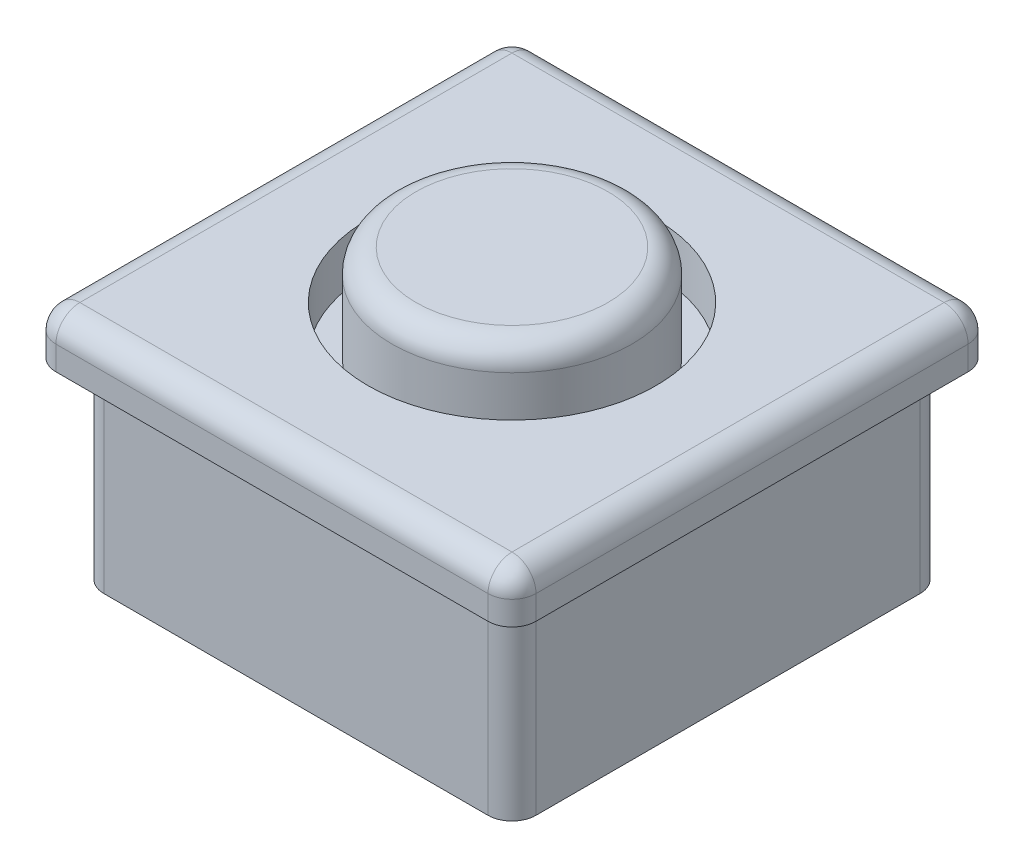
ISO-10303-21;
HEADER;
FILE_DESCRIPTION(('STEP AP214'),'2;1');
FILE_NAME('part.step','',(''),(''),'','','');
FILE_SCHEMA(('AUTOMOTIVE_DESIGN { 1 0 10303 214 1 1 1 1 }'));
ENDSEC;
DATA;
#1=APPLICATION_CONTEXT('core data for automotive mechanical design processes');
#2=APPLICATION_PROTOCOL_DEFINITION('international standard','automotive_design',2000,#1);
#3=PRODUCT_CONTEXT('',#1,'mechanical');
#4=PRODUCT('Part','Part','',(#3));
#5=PRODUCT_RELATED_PRODUCT_CATEGORY('part','',(#4));
#6=PRODUCT_DEFINITION_FORMATION('','',#4);
#7=PRODUCT_DEFINITION_CONTEXT('part definition',#1,'design');
#8=PRODUCT_DEFINITION('design','',#6,#7);
#9=PRODUCT_DEFINITION_SHAPE('','',#8);
#10=(LENGTH_UNIT() NAMED_UNIT(*) SI_UNIT(.MILLI.,.METRE.));
#11=(NAMED_UNIT(*) PLANE_ANGLE_UNIT() SI_UNIT($,.RADIAN.));
#12=(NAMED_UNIT(*) SI_UNIT($,.STERADIAN.) SOLID_ANGLE_UNIT());
#13=UNCERTAINTY_MEASURE_WITH_UNIT(LENGTH_MEASURE(1.E-05),#10,'distance_accuracy_value','');
#14=(GEOMETRIC_REPRESENTATION_CONTEXT(3) GLOBAL_UNCERTAINTY_ASSIGNED_CONTEXT((#13)) GLOBAL_UNIT_ASSIGNED_CONTEXT((#10,
#11,#12)) REPRESENTATION_CONTEXT('',''));
#15=CARTESIAN_POINT('',(0.,0.,0.));
#16=DIRECTION('',(0.,0.,1.));
#17=DIRECTION('',(1.,0.,0.));
#18=AXIS2_PLACEMENT_3D('',#15,#16,#17);
#19=CARTESIAN_POINT('',(1.,0.,-1.));
#20=DIRECTION('',(0.,-1.,0.));
#21=DIRECTION('',(0.,0.,-1.));
#22=AXIS2_PLACEMENT_3D('',#19,#20,#21);
#23=PLANE('',#22);
#24=CARTESIAN_POINT('',(1.,0.,-1.));
#25=DIRECTION('',(0.,1.,0.));
#26=DIRECTION('',(0.,0.,-1.));
#27=AXIS2_PLACEMENT_3D('',#24,#25,#26);
#28=CIRCLE('',#27,1.);
#29=CARTESIAN_POINT('',(0.,0.,-1.00000000000001));
#30=VERTEX_POINT('',#29);
#31=CARTESIAN_POINT('',(1.00000000000001,0.,0.));
#32=VERTEX_POINT('',#31);
#33=EDGE_CURVE('E248',#30,#32,#28,.T.);
#34=ORIENTED_EDGE('',*,*,#33,.F.);
#35=DIRECTION('',(0.,0.,1.));
#36=VECTOR('',#35,1.);
#37=CARTESIAN_POINT('',(0.,0.,-1.00000000000001));
#38=LINE('',#37,#36);
#39=CARTESIAN_POINT('',(0.,0.,-19.));
#40=VERTEX_POINT('',#39);
#41=EDGE_CURVE('E271',#40,#30,#38,.T.);
#42=ORIENTED_EDGE('',*,*,#41,.F.);
#43=CARTESIAN_POINT('',(1.,0.,-19.));
#44=DIRECTION('',(0.,1.,0.));
#45=DIRECTION('',(0.,0.,-1.));
#46=AXIS2_PLACEMENT_3D('',#43,#44,#45);
#47=CIRCLE('',#46,1.);
#48=CARTESIAN_POINT('',(1.00000000000001,0.,-20.));
#49=VERTEX_POINT('',#48);
#50=EDGE_CURVE('E268',#49,#40,#47,.T.);
#51=ORIENTED_EDGE('',*,*,#50,.F.);
#52=DIRECTION('',(-1.,0.,0.));
#53=VECTOR('',#52,1.);
#54=CARTESIAN_POINT('',(1.00000000000001,0.,-20.));
#55=LINE('',#54,#53);
#56=CARTESIAN_POINT('',(19.,0.,-20.));
#57=VERTEX_POINT('',#56);
#58=EDGE_CURVE('E265',#57,#49,#55,.T.);
#59=ORIENTED_EDGE('',*,*,#58,.F.);
#60=CARTESIAN_POINT('',(19.,0.,-19.));
#61=DIRECTION('',(0.,1.,0.));
#62=DIRECTION('',(0.,0.,-1.));
#63=AXIS2_PLACEMENT_3D('',#60,#61,#62);
#64=CIRCLE('',#63,1.);
#65=CARTESIAN_POINT('',(20.,0.,-19.));
#66=VERTEX_POINT('',#65);
#67=EDGE_CURVE('E262',#66,#57,#64,.T.);
#68=ORIENTED_EDGE('',*,*,#67,.F.);
#69=DIRECTION('',(0.,0.,-1.));
#70=VECTOR('',#69,1.);
#71=CARTESIAN_POINT('',(20.,0.,-1.00000000000001));
#72=LINE('',#71,#70);
#73=CARTESIAN_POINT('',(20.,0.,-1.00000000000001));
#74=VERTEX_POINT('',#73);
#75=EDGE_CURVE('E259',#74,#66,#72,.T.);
#76=ORIENTED_EDGE('',*,*,#75,.F.);
#77=CARTESIAN_POINT('',(19.,0.,-1.));
#78=DIRECTION('',(0.,1.,0.));
#79=DIRECTION('',(0.,0.,1.));
#80=AXIS2_PLACEMENT_3D('',#77,#78,#79);
#81=CIRCLE('',#80,1.);
#82=CARTESIAN_POINT('',(19.,0.,0.));
#83=VERTEX_POINT('',#82);
#84=EDGE_CURVE('E256',#83,#74,#81,.T.);
#85=ORIENTED_EDGE('',*,*,#84,.F.);
#86=DIRECTION('',(1.,0.,0.));
#87=VECTOR('',#86,1.);
#88=CARTESIAN_POINT('',(1.00000000000001,0.,0.));
#89=LINE('',#88,#87);
#90=EDGE_CURVE('E253',#32,#83,#89,.T.);
#91=ORIENTED_EDGE('',*,*,#90,.F.);
#92=EDGE_LOOP('',(#34,#42,#51,#59,#68,#76,#85,#91));
#93=FACE_BOUND('',#92,.T.);
#94=DIRECTION('',(1.,0.,0.));
#95=VECTOR('',#94,1.);
#96=CARTESIAN_POINT('',(2.00000000000001,0.,-1.));
#97=LINE('',#96,#95);
#98=CARTESIAN_POINT('',(2.00000000000001,0.,-1.));
#99=VERTEX_POINT('',#98);
#100=CARTESIAN_POINT('',(18.,0.,-1.));
#101=VERTEX_POINT('',#100);
#102=EDGE_CURVE('E193',#99,#101,#97,.T.);
#103=ORIENTED_EDGE('',*,*,#102,.T.);
#104=CARTESIAN_POINT('',(18.,0.,-2.));
#105=DIRECTION('',(0.,1.,0.));
#106=DIRECTION('',(0.,0.,1.));
#107=AXIS2_PLACEMENT_3D('',#104,#105,#106);
#108=CIRCLE('',#107,1.);
#109=CARTESIAN_POINT('',(19.,0.,-2.00000000000001));
#110=VERTEX_POINT('',#109);
#111=EDGE_CURVE('E215',#101,#110,#108,.T.);
#112=ORIENTED_EDGE('',*,*,#111,.T.);
#113=DIRECTION('',(0.,0.,-1.));
#114=VECTOR('',#113,1.);
#115=CARTESIAN_POINT('',(19.,0.,-2.00000000000001));
#116=LINE('',#115,#114);
#117=CARTESIAN_POINT('',(19.,0.,-18.));
#118=VERTEX_POINT('',#117);
#119=EDGE_CURVE('E172',#110,#118,#116,.T.);
#120=ORIENTED_EDGE('',*,*,#119,.T.);
#121=CARTESIAN_POINT('',(18.,0.,-18.));
#122=DIRECTION('',(0.,1.,0.));
#123=DIRECTION('',(0.,0.,1.));
#124=AXIS2_PLACEMENT_3D('',#121,#122,#123);
#125=CIRCLE('',#124,1.);
#126=CARTESIAN_POINT('',(18.,0.,-19.));
#127=VERTEX_POINT('',#126);
#128=EDGE_CURVE('E218',#118,#127,#125,.T.);
#129=ORIENTED_EDGE('',*,*,#128,.T.);
#130=DIRECTION('',(-1.,0.,0.));
#131=VECTOR('',#130,1.);
#132=CARTESIAN_POINT('',(2.00000000000001,0.,-19.));
#133=LINE('',#132,#131);
#134=CARTESIAN_POINT('',(2.00000000000001,0.,-19.));
#135=VERTEX_POINT('',#134);
#136=EDGE_CURVE('E221',#127,#135,#133,.T.);
#137=ORIENTED_EDGE('',*,*,#136,.T.);
#138=CARTESIAN_POINT('',(2.,0.,-18.));
#139=DIRECTION('',(0.,1.,0.));
#140=DIRECTION('',(0.,0.,1.));
#141=AXIS2_PLACEMENT_3D('',#138,#139,#140);
#142=CIRCLE('',#141,1.);
#143=CARTESIAN_POINT('',(0.999999999999999,0.,-18.));
#144=VERTEX_POINT('',#143);
#145=EDGE_CURVE('E224',#135,#144,#142,.T.);
#146=ORIENTED_EDGE('',*,*,#145,.T.);
#147=DIRECTION('',(0.,0.,1.));
#148=VECTOR('',#147,1.);
#149=CARTESIAN_POINT('',(0.999999999999999,0.,-2.00000000000001));
#150=LINE('',#149,#148);
#151=CARTESIAN_POINT('',(0.999999999999999,0.,-2.00000000000001));
#152=VERTEX_POINT('',#151);
#153=EDGE_CURVE('E227',#144,#152,#150,.T.);
#154=ORIENTED_EDGE('',*,*,#153,.T.);
#155=CARTESIAN_POINT('',(2.,0.,-2.));
#156=DIRECTION('',(0.,1.,0.));
#157=DIRECTION('',(0.,0.,-1.));
#158=AXIS2_PLACEMENT_3D('',#155,#156,#157);
#159=CIRCLE('',#158,1.);
#160=EDGE_CURVE('E196',#152,#99,#159,.T.);
#161=ORIENTED_EDGE('',*,*,#160,.T.);
#162=EDGE_LOOP('',(#103,#112,#120,#129,#137,#146,#154,#161));
#163=FACE_BOUND('',#162,.T.);
#164=ADVANCED_FACE('F39',(#93,#163),#23,.T.);
#165=CARTESIAN_POINT('',(1.,2.,-1.));
#166=DIRECTION('',(0.,-1.,0.));
#167=DIRECTION('',(0.,0.,-1.));
#168=AXIS2_PLACEMENT_3D('',#165,#166,#167);
#169=PLANE('',#168);
#170=DIRECTION('',(0.,0.,1.));
#171=VECTOR('',#170,1.);
#172=CARTESIAN_POINT('',(1.,2.,-1.));
#173=LINE('',#172,#171);
#174=CARTESIAN_POINT('',(1.,2.,-19.));
#175=VERTEX_POINT('',#174);
#176=CARTESIAN_POINT('',(1.,2.,-1.));
#177=VERTEX_POINT('',#176);
#178=EDGE_CURVE('E297',#175,#177,#173,.T.);
#179=ORIENTED_EDGE('',*,*,#178,.T.);
#180=DIRECTION('',(1.,0.,0.));
#181=VECTOR('',#180,1.);
#182=CARTESIAN_POINT('',(1.,2.,-1.));
#183=LINE('',#182,#181);
#184=CARTESIAN_POINT('',(19.,2.,-1.));
#185=VERTEX_POINT('',#184);
#186=EDGE_CURVE('E299',#177,#185,#183,.T.);
#187=ORIENTED_EDGE('',*,*,#186,.T.);
#188=DIRECTION('',(0.,0.,-1.));
#189=VECTOR('',#188,1.);
#190=CARTESIAN_POINT('',(19.,2.,-1.));
#191=LINE('',#190,#189);
#192=CARTESIAN_POINT('',(19.,2.,-19.));
#193=VERTEX_POINT('',#192);
#194=EDGE_CURVE('E293',#185,#193,#191,.T.);
#195=ORIENTED_EDGE('',*,*,#194,.T.);
#196=DIRECTION('',(-1.,0.,0.));
#197=VECTOR('',#196,1.);
#198=CARTESIAN_POINT('',(1.,2.,-19.));
#199=LINE('',#198,#197);
#200=EDGE_CURVE('E295',#193,#175,#199,.T.);
#201=ORIENTED_EDGE('',*,*,#200,.T.);
#202=EDGE_LOOP('',(#179,#187,#195,#201));
#203=FACE_BOUND('',#202,.T.);
#204=CARTESIAN_POINT('',(10.,2.,-10.));
#205=DIRECTION('',(0.,1.,0.));
#206=DIRECTION('',(0.,0.,1.));
#207=AXIS2_PLACEMENT_3D('',#204,#205,#206);
#208=CIRCLE('',#207,6.);
#209=CARTESIAN_POINT('',(10.,2.,-4.));
#210=VERTEX_POINT('',#209);
#211=EDGE_CURVE('E245',#210,#210,#208,.T.);
#212=ORIENTED_EDGE('',*,*,#211,.F.);
#213=EDGE_LOOP('',(#212));
#214=FACE_BOUND('',#213,.T.);
#215=ADVANCED_FACE('F368',(#203,#214),#169,.F.);
#216=CARTESIAN_POINT('',(1.,2.,-1.));
#217=DIRECTION('',(0.,-1.,0.));
#218=DIRECTION('',(0.,0.,-1.));
#219=AXIS2_PLACEMENT_3D('',#216,#217,#218);
#220=CYLINDRICAL_SURFACE('',#219,1.);
#221=DIRECTION('',(0.,-1.,0.));
#222=VECTOR('',#221,1.);
#223=CARTESIAN_POINT('',(1.00000000000001,2.,0.));
#224=LINE('',#223,#222);
#225=CARTESIAN_POINT('',(1.00000000000001,1.,0.));
#226=VERTEX_POINT('',#225);
#227=EDGE_CURVE('E288',#226,#32,#224,.T.);
#228=ORIENTED_EDGE('',*,*,#227,.F.);
#229=CARTESIAN_POINT('',(1.,1.,-1.));
#230=DIRECTION('',(0.,-1.,0.));
#231=DIRECTION('',(0.,0.,-1.));
#232=AXIS2_PLACEMENT_3D('',#229,#230,#231);
#233=CIRCLE('',#232,1.);
#234=CARTESIAN_POINT('',(0.,1.,-1.00000000000001));
#235=VERTEX_POINT('',#234);
#236=EDGE_CURVE('E304',#226,#235,#233,.T.);
#237=ORIENTED_EDGE('',*,*,#236,.T.);
#238=DIRECTION('',(0.,-1.,0.));
#239=VECTOR('',#238,1.);
#240=CARTESIAN_POINT('',(0.,2.,-1.00000000000001));
#241=LINE('',#240,#239);
#242=EDGE_CURVE('E274',#235,#30,#241,.T.);
#243=ORIENTED_EDGE('',*,*,#242,.T.);
#244=ORIENTED_EDGE('',*,*,#33,.T.);
#245=EDGE_LOOP('',(#228,#237,#243,#244));
#246=FACE_BOUND('',#245,.T.);
#247=ADVANCED_FACE('F374',(#246),#220,.T.);
#248=CARTESIAN_POINT('',(1.00000000000001,2.,0.));
#249=DIRECTION('',(0.,0.,-1.));
#250=DIRECTION('',(-1.,0.,0.));
#251=AXIS2_PLACEMENT_3D('',#248,#249,#250);
#252=PLANE('',#251);
#253=DIRECTION('',(0.,-1.,0.));
#254=VECTOR('',#253,1.);
#255=CARTESIAN_POINT('',(19.,2.,0.));
#256=LINE('',#255,#254);
#257=CARTESIAN_POINT('',(19.,1.,0.));
#258=VERTEX_POINT('',#257);
#259=EDGE_CURVE('E286',#258,#83,#256,.T.);
#260=ORIENTED_EDGE('',*,*,#259,.F.);
#261=DIRECTION('',(1.,0.,0.));
#262=VECTOR('',#261,1.);
#263=CARTESIAN_POINT('',(1.00000000000001,1.,0.));
#264=LINE('',#263,#262);
#265=EDGE_CURVE('E302',#258,#226,#264,.F.);
#266=ORIENTED_EDGE('',*,*,#265,.T.);
#267=ORIENTED_EDGE('',*,*,#227,.T.);
#268=ORIENTED_EDGE('',*,*,#90,.T.);
#269=EDGE_LOOP('',(#260,#266,#267,#268));
#270=FACE_BOUND('',#269,.T.);
#271=ADVANCED_FACE('F395',(#270),#252,.F.);
#272=CARTESIAN_POINT('',(19.,2.,-1.));
#273=DIRECTION('',(0.,-1.,0.));
#274=DIRECTION('',(0.,0.,-1.));
#275=AXIS2_PLACEMENT_3D('',#272,#273,#274);
#276=CYLINDRICAL_SURFACE('',#275,1.);
#277=DIRECTION('',(0.,-1.,0.));
#278=VECTOR('',#277,1.);
#279=CARTESIAN_POINT('',(20.,2.,-1.00000000000001));
#280=LINE('',#279,#278);
#281=CARTESIAN_POINT('',(20.,1.,-1.00000000000001));
#282=VERTEX_POINT('',#281);
#283=EDGE_CURVE('E284',#282,#74,#280,.T.);
#284=ORIENTED_EDGE('',*,*,#283,.F.);
#285=CARTESIAN_POINT('',(19.,1.,-1.));
#286=DIRECTION('',(0.,-1.,0.));
#287=DIRECTION('',(0.,0.,-1.));
#288=AXIS2_PLACEMENT_3D('',#285,#286,#287);
#289=CIRCLE('',#288,1.);
#290=EDGE_CURVE('E290',#282,#258,#289,.T.);
#291=ORIENTED_EDGE('',*,*,#290,.T.);
#292=ORIENTED_EDGE('',*,*,#259,.T.);
#293=ORIENTED_EDGE('',*,*,#84,.T.);
#294=EDGE_LOOP('',(#284,#291,#292,#293));
#295=FACE_BOUND('',#294,.T.);
#296=ADVANCED_FACE('F391',(#295),#276,.T.);
#297=CARTESIAN_POINT('',(20.,2.,-1.00000000000001));
#298=DIRECTION('',(-1.,0.,0.));
#299=DIRECTION('',(0.,0.,1.));
#300=AXIS2_PLACEMENT_3D('',#297,#298,#299);
#301=PLANE('',#300);
#302=DIRECTION('',(0.,-1.,0.));
#303=VECTOR('',#302,1.);
#304=CARTESIAN_POINT('',(20.,2.,-19.));
#305=LINE('',#304,#303);
#306=CARTESIAN_POINT('',(20.,1.,-19.));
#307=VERTEX_POINT('',#306);
#308=EDGE_CURVE('E282',#307,#66,#305,.T.);
#309=ORIENTED_EDGE('',*,*,#308,.F.);
#310=DIRECTION('',(0.,0.,-1.));
#311=VECTOR('',#310,1.);
#312=CARTESIAN_POINT('',(20.,1.,-1.00000000000001));
#313=LINE('',#312,#311);
#314=EDGE_CURVE('E312',#307,#282,#313,.F.);
#315=ORIENTED_EDGE('',*,*,#314,.T.);
#316=ORIENTED_EDGE('',*,*,#283,.T.);
#317=ORIENTED_EDGE('',*,*,#75,.T.);
#318=EDGE_LOOP('',(#309,#315,#316,#317));
#319=FACE_BOUND('',#318,.T.);
#320=ADVANCED_FACE('F388',(#319),#301,.F.);
#321=CARTESIAN_POINT('',(19.,2.,-19.));
#322=DIRECTION('',(0.,-1.,0.));
#323=DIRECTION('',(0.,0.,-1.));
#324=AXIS2_PLACEMENT_3D('',#321,#322,#323);
#325=CYLINDRICAL_SURFACE('',#324,1.);
#326=DIRECTION('',(0.,-1.,0.));
#327=VECTOR('',#326,1.);
#328=CARTESIAN_POINT('',(19.,2.,-20.));
#329=LINE('',#328,#327);
#330=CARTESIAN_POINT('',(19.,1.,-20.));
#331=VERTEX_POINT('',#330);
#332=EDGE_CURVE('E280',#331,#57,#329,.T.);
#333=ORIENTED_EDGE('',*,*,#332,.F.);
#334=CARTESIAN_POINT('',(19.,1.,-19.));
#335=DIRECTION('',(0.,-1.,0.));
#336=DIRECTION('',(0.,0.,-1.));
#337=AXIS2_PLACEMENT_3D('',#334,#335,#336);
#338=CIRCLE('',#337,1.);
#339=EDGE_CURVE('E56',#331,#307,#338,.T.);
#340=ORIENTED_EDGE('',*,*,#339,.T.);
#341=ORIENTED_EDGE('',*,*,#308,.T.);
#342=ORIENTED_EDGE('',*,*,#67,.T.);
#343=EDGE_LOOP('',(#333,#340,#341,#342));
#344=FACE_BOUND('',#343,.T.);
#345=ADVANCED_FACE('F385',(#344),#325,.T.);
#346=CARTESIAN_POINT('',(1.00000000000001,2.,-20.));
#347=DIRECTION('',(0.,0.,1.));
#348=DIRECTION('',(1.,0.,0.));
#349=AXIS2_PLACEMENT_3D('',#346,#347,#348);
#350=PLANE('',#349);
#351=DIRECTION('',(0.,-1.,0.));
#352=VECTOR('',#351,1.);
#353=CARTESIAN_POINT('',(1.00000000000001,2.,-20.));
#354=LINE('',#353,#352);
#355=CARTESIAN_POINT('',(1.00000000000001,1.,-20.));
#356=VERTEX_POINT('',#355);
#357=EDGE_CURVE('E278',#356,#49,#354,.T.);
#358=ORIENTED_EDGE('',*,*,#357,.F.);
#359=DIRECTION('',(-1.,0.,0.));
#360=VECTOR('',#359,1.);
#361=CARTESIAN_POINT('',(1.00000000000001,1.,-20.));
#362=LINE('',#361,#360);
#363=EDGE_CURVE('E64',#356,#331,#362,.F.);
#364=ORIENTED_EDGE('',*,*,#363,.T.);
#365=ORIENTED_EDGE('',*,*,#332,.T.);
#366=ORIENTED_EDGE('',*,*,#58,.T.);
#367=EDGE_LOOP('',(#358,#364,#365,#366));
#368=FACE_BOUND('',#367,.T.);
#369=ADVANCED_FACE('F381',(#368),#350,.F.);
#370=CARTESIAN_POINT('',(1.,2.,-19.));
#371=DIRECTION('',(0.,-1.,0.));
#372=DIRECTION('',(0.,0.,-1.));
#373=AXIS2_PLACEMENT_3D('',#370,#371,#372);
#374=CYLINDRICAL_SURFACE('',#373,1.);
#375=DIRECTION('',(0.,-1.,0.));
#376=VECTOR('',#375,1.);
#377=CARTESIAN_POINT('',(0.,2.,-19.));
#378=LINE('',#377,#376);
#379=CARTESIAN_POINT('',(0.,1.,-19.));
#380=VERTEX_POINT('',#379);
#381=EDGE_CURVE('E276',#380,#40,#378,.T.);
#382=ORIENTED_EDGE('',*,*,#381,.F.);
#383=CARTESIAN_POINT('',(1.,1.,-19.));
#384=DIRECTION('',(0.,-1.,0.));
#385=DIRECTION('',(0.,0.,-1.));
#386=AXIS2_PLACEMENT_3D('',#383,#384,#385);
#387=CIRCLE('',#386,1.);
#388=EDGE_CURVE('E308',#380,#356,#387,.T.);
#389=ORIENTED_EDGE('',*,*,#388,.T.);
#390=ORIENTED_EDGE('',*,*,#357,.T.);
#391=ORIENTED_EDGE('',*,*,#50,.T.);
#392=EDGE_LOOP('',(#382,#389,#390,#391));
#393=FACE_BOUND('',#392,.T.);
#394=ADVANCED_FACE('F363',(#393),#374,.T.);
#395=CARTESIAN_POINT('',(0.,2.,-1.00000000000001));
#396=DIRECTION('',(1.,0.,0.));
#397=DIRECTION('',(0.,0.,-1.));
#398=AXIS2_PLACEMENT_3D('',#395,#396,#397);
#399=PLANE('',#398);
#400=ORIENTED_EDGE('',*,*,#242,.F.);
#401=DIRECTION('',(0.,0.,1.));
#402=VECTOR('',#401,1.);
#403=CARTESIAN_POINT('',(0.,1.,-1.00000000000001));
#404=LINE('',#403,#402);
#405=EDGE_CURVE('E306',#235,#380,#404,.F.);
#406=ORIENTED_EDGE('',*,*,#405,.T.);
#407=ORIENTED_EDGE('',*,*,#381,.T.);
#408=ORIENTED_EDGE('',*,*,#41,.T.);
#409=EDGE_LOOP('',(#400,#406,#407,#408));
#410=FACE_BOUND('',#409,.T.);
#411=ADVANCED_FACE('F354',(#410),#399,.F.);
#412=CARTESIAN_POINT('',(10.,2.,-10.));
#413=DIRECTION('',(0.,-1.,0.));
#414=DIRECTION('',(0.,0.,-1.));
#415=AXIS2_PLACEMENT_3D('',#412,#413,#414);
#416=CYLINDRICAL_SURFACE('',#415,6.);
#417=ORIENTED_EDGE('',*,*,#211,.T.);
#418=EDGE_LOOP('',(#417));
#419=FACE_BOUND('',#418,.T.);
#420=CARTESIAN_POINT('',(10.,0.,-10.));
#421=DIRECTION('',(0.,1.,0.));
#422=DIRECTION('',(0.,0.,1.));
#423=AXIS2_PLACEMENT_3D('',#420,#421,#422);
#424=CIRCLE('',#423,6.);
#425=CARTESIAN_POINT('',(10.,0.,-4.));
#426=VERTEX_POINT('',#425);
#427=EDGE_CURVE('E233',#426,#426,#424,.T.);
#428=ORIENTED_EDGE('',*,*,#427,.F.);
#429=EDGE_LOOP('',(#428));
#430=FACE_BOUND('',#429,.T.);
#431=ADVANCED_FACE('F352',(#419,#430),#416,.F.);
#432=CARTESIAN_POINT('',(18.,-8.,-2.));
#433=DIRECTION('',(0.,1.,0.));
#434=DIRECTION('',(0.,0.,1.));
#435=AXIS2_PLACEMENT_3D('',#432,#433,#434);
#436=PLANE('',#435);
#437=CARTESIAN_POINT('',(18.,-8.,-2.));
#438=DIRECTION('',(0.,1.,0.));
#439=DIRECTION('',(0.,0.,1.));
#440=AXIS2_PLACEMENT_3D('',#437,#438,#439);
#441=CIRCLE('',#440,1.);
#442=CARTESIAN_POINT('',(18.,-8.,-1.));
#443=VERTEX_POINT('',#442);
#444=CARTESIAN_POINT('',(19.,-8.,-2.00000000000001));
#445=VERTEX_POINT('',#444);
#446=EDGE_CURVE('E184',#443,#445,#441,.T.);
#447=ORIENTED_EDGE('',*,*,#446,.F.);
#448=DIRECTION('',(1.,0.,0.));
#449=VECTOR('',#448,1.);
#450=CARTESIAN_POINT('',(2.00000000000001,-8.,-1.));
#451=LINE('',#450,#449);
#452=CARTESIAN_POINT('',(2.00000000000001,-8.,-1.));
#453=VERTEX_POINT('',#452);
#454=EDGE_CURVE('E177',#453,#443,#451,.T.);
#455=ORIENTED_EDGE('',*,*,#454,.F.);
#456=CARTESIAN_POINT('',(2.,-8.,-2.));
#457=DIRECTION('',(0.,1.,0.));
#458=DIRECTION('',(0.,0.,-1.));
#459=AXIS2_PLACEMENT_3D('',#456,#457,#458);
#460=CIRCLE('',#459,1.);
#461=CARTESIAN_POINT('',(0.999999999999999,-8.,-2.00000000000001));
#462=VERTEX_POINT('',#461);
#463=EDGE_CURVE('E211',#462,#453,#460,.T.);
#464=ORIENTED_EDGE('',*,*,#463,.F.);
#465=DIRECTION('',(0.,0.,1.));
#466=VECTOR('',#465,1.);
#467=CARTESIAN_POINT('',(0.999999999999999,-8.,-2.00000000000001));
#468=LINE('',#467,#466);
#469=CARTESIAN_POINT('',(0.999999999999999,-8.,-18.));
#470=VERTEX_POINT('',#469);
#471=EDGE_CURVE('E208',#470,#462,#468,.T.);
#472=ORIENTED_EDGE('',*,*,#471,.F.);
#473=CARTESIAN_POINT('',(2.,-8.,-18.));
#474=DIRECTION('',(0.,1.,0.));
#475=DIRECTION('',(0.,0.,1.));
#476=AXIS2_PLACEMENT_3D('',#473,#474,#475);
#477=CIRCLE('',#476,1.);
#478=CARTESIAN_POINT('',(2.00000000000001,-8.,-19.));
#479=VERTEX_POINT('',#478);
#480=EDGE_CURVE('E205',#479,#470,#477,.T.);
#481=ORIENTED_EDGE('',*,*,#480,.F.);
#482=DIRECTION('',(-1.,0.,0.));
#483=VECTOR('',#482,1.);
#484=CARTESIAN_POINT('',(2.00000000000001,-8.,-19.));
#485=LINE('',#484,#483);
#486=CARTESIAN_POINT('',(18.,-8.,-19.));
#487=VERTEX_POINT('',#486);
#488=EDGE_CURVE('E202',#487,#479,#485,.T.);
#489=ORIENTED_EDGE('',*,*,#488,.F.);
#490=CARTESIAN_POINT('',(18.,-8.,-18.));
#491=DIRECTION('',(0.,1.,0.));
#492=DIRECTION('',(0.,0.,1.));
#493=AXIS2_PLACEMENT_3D('',#490,#491,#492);
#494=CIRCLE('',#493,1.);
#495=CARTESIAN_POINT('',(19.,-8.,-18.));
#496=VERTEX_POINT('',#495);
#497=EDGE_CURVE('E188',#496,#487,#494,.T.);
#498=ORIENTED_EDGE('',*,*,#497,.F.);
#499=DIRECTION('',(0.,0.,-1.));
#500=VECTOR('',#499,1.);
#501=CARTESIAN_POINT('',(19.,-8.,-2.00000000000001));
#502=LINE('',#501,#500);
#503=EDGE_CURVE('E170',#445,#496,#502,.T.);
#504=ORIENTED_EDGE('',*,*,#503,.F.);
#505=EDGE_LOOP('',(#447,#455,#464,#472,#481,#489,#498,#504));
#506=FACE_BOUND('',#505,.T.);
#507=ADVANCED_FACE('F182',(#506),#436,.F.);
#508=CARTESIAN_POINT('',(19.,-8.,-2.00000000000001));
#509=DIRECTION('',(1.,0.,0.));
#510=DIRECTION('',(0.,0.,-1.));
#511=AXIS2_PLACEMENT_3D('',#508,#509,#510);
#512=PLANE('',#511);
#513=ORIENTED_EDGE('',*,*,#119,.F.);
#514=DIRECTION('',(0.,1.,0.));
#515=VECTOR('',#514,1.);
#516=CARTESIAN_POINT('',(19.,-8.,-2.00000000000001));
#517=LINE('',#516,#515);
#518=EDGE_CURVE('E167',#445,#110,#517,.T.);
#519=ORIENTED_EDGE('',*,*,#518,.F.);
#520=ORIENTED_EDGE('',*,*,#503,.T.);
#521=DIRECTION('',(0.,1.,0.));
#522=VECTOR('',#521,1.);
#523=CARTESIAN_POINT('',(19.,-8.,-18.));
#524=LINE('',#523,#522);
#525=EDGE_CURVE('E176',#496,#118,#524,.T.);
#526=ORIENTED_EDGE('',*,*,#525,.T.);
#527=EDGE_LOOP('',(#513,#519,#520,#526));
#528=FACE_BOUND('',#527,.T.);
#529=ADVANCED_FACE('F169',(#528),#512,.T.);
#530=CARTESIAN_POINT('',(18.,-8.,-18.));
#531=DIRECTION('',(0.,1.,0.));
#532=DIRECTION('',(0.,0.,1.));
#533=AXIS2_PLACEMENT_3D('',#530,#531,#532);
#534=CYLINDRICAL_SURFACE('',#533,1.);
#535=ORIENTED_EDGE('',*,*,#128,.F.);
#536=ORIENTED_EDGE('',*,*,#525,.F.);
#537=ORIENTED_EDGE('',*,*,#497,.T.);
#538=DIRECTION('',(0.,1.,0.));
#539=VECTOR('',#538,1.);
#540=CARTESIAN_POINT('',(18.,-8.,-19.));
#541=LINE('',#540,#539);
#542=EDGE_CURVE('E242',#487,#127,#541,.T.);
#543=ORIENTED_EDGE('',*,*,#542,.T.);
#544=EDGE_LOOP('',(#535,#536,#537,#543));
#545=FACE_BOUND('',#544,.T.);
#546=ADVANCED_FACE('F489',(#545),#534,.T.);
#547=CARTESIAN_POINT('',(2.00000000000001,-8.,-19.));
#548=DIRECTION('',(0.,0.,-1.));
#549=DIRECTION('',(-1.,0.,0.));
#550=AXIS2_PLACEMENT_3D('',#547,#548,#549);
#551=PLANE('',#550);
#552=ORIENTED_EDGE('',*,*,#136,.F.);
#553=ORIENTED_EDGE('',*,*,#542,.F.);
#554=ORIENTED_EDGE('',*,*,#488,.T.);
#555=DIRECTION('',(0.,1.,0.));
#556=VECTOR('',#555,1.);
#557=CARTESIAN_POINT('',(2.00000000000001,-8.,-19.));
#558=LINE('',#557,#556);
#559=EDGE_CURVE('E240',#479,#135,#558,.T.);
#560=ORIENTED_EDGE('',*,*,#559,.T.);
#561=EDGE_LOOP('',(#552,#553,#554,#560));
#562=FACE_BOUND('',#561,.T.);
#563=ADVANCED_FACE('F485',(#562),#551,.T.);
#564=CARTESIAN_POINT('',(2.,-8.,-18.));
#565=DIRECTION('',(0.,1.,0.));
#566=DIRECTION('',(0.,0.,1.));
#567=AXIS2_PLACEMENT_3D('',#564,#565,#566);
#568=CYLINDRICAL_SURFACE('',#567,1.);
#569=ORIENTED_EDGE('',*,*,#145,.F.);
#570=ORIENTED_EDGE('',*,*,#559,.F.);
#571=ORIENTED_EDGE('',*,*,#480,.T.);
#572=DIRECTION('',(0.,1.,0.));
#573=VECTOR('',#572,1.);
#574=CARTESIAN_POINT('',(0.999999999999999,-8.,-18.));
#575=LINE('',#574,#573);
#576=EDGE_CURVE('E238',#470,#144,#575,.T.);
#577=ORIENTED_EDGE('',*,*,#576,.T.);
#578=EDGE_LOOP('',(#569,#570,#571,#577));
#579=FACE_BOUND('',#578,.T.);
#580=ADVANCED_FACE('F481',(#579),#568,.T.);
#581=CARTESIAN_POINT('',(0.999999999999999,-8.,-2.00000000000001));
#582=DIRECTION('',(-1.,0.,0.));
#583=DIRECTION('',(0.,0.,1.));
#584=AXIS2_PLACEMENT_3D('',#581,#582,#583);
#585=PLANE('',#584);
#586=ORIENTED_EDGE('',*,*,#153,.F.);
#587=ORIENTED_EDGE('',*,*,#576,.F.);
#588=ORIENTED_EDGE('',*,*,#471,.T.);
#589=DIRECTION('',(0.,1.,0.));
#590=VECTOR('',#589,1.);
#591=CARTESIAN_POINT('',(0.999999999999999,-8.,-2.00000000000001));
#592=LINE('',#591,#590);
#593=EDGE_CURVE('E236',#462,#152,#592,.T.);
#594=ORIENTED_EDGE('',*,*,#593,.T.);
#595=EDGE_LOOP('',(#586,#587,#588,#594));
#596=FACE_BOUND('',#595,.T.);
#597=ADVANCED_FACE('F477',(#596),#585,.T.);
#598=CARTESIAN_POINT('',(2.,-8.,-2.));
#599=DIRECTION('',(0.,1.,0.));
#600=DIRECTION('',(0.,0.,1.));
#601=AXIS2_PLACEMENT_3D('',#598,#599,#600);
#602=CYLINDRICAL_SURFACE('',#601,1.);
#603=ORIENTED_EDGE('',*,*,#160,.F.);
#604=ORIENTED_EDGE('',*,*,#593,.F.);
#605=ORIENTED_EDGE('',*,*,#463,.T.);
#606=DIRECTION('',(0.,1.,0.));
#607=VECTOR('',#606,1.);
#608=CARTESIAN_POINT('',(2.00000000000001,-8.,-1.));
#609=LINE('',#608,#607);
#610=EDGE_CURVE('E234',#453,#99,#609,.T.);
#611=ORIENTED_EDGE('',*,*,#610,.T.);
#612=EDGE_LOOP('',(#603,#604,#605,#611));
#613=FACE_BOUND('',#612,.T.);
#614=ADVANCED_FACE('F473',(#613),#602,.T.);
#615=CARTESIAN_POINT('',(2.00000000000001,-8.,-1.));
#616=DIRECTION('',(0.,0.,1.));
#617=DIRECTION('',(1.,0.,0.));
#618=AXIS2_PLACEMENT_3D('',#615,#616,#617);
#619=PLANE('',#618);
#620=ORIENTED_EDGE('',*,*,#102,.F.);
#621=ORIENTED_EDGE('',*,*,#610,.F.);
#622=ORIENTED_EDGE('',*,*,#454,.T.);
#623=DIRECTION('',(0.,1.,0.));
#624=VECTOR('',#623,1.);
#625=CARTESIAN_POINT('',(18.,-8.,-1.));
#626=LINE('',#625,#624);
#627=EDGE_CURVE('E192',#443,#101,#626,.T.);
#628=ORIENTED_EDGE('',*,*,#627,.T.);
#629=EDGE_LOOP('',(#620,#621,#622,#628));
#630=FACE_BOUND('',#629,.T.);
#631=ADVANCED_FACE('F470',(#630),#619,.T.);
#632=CARTESIAN_POINT('',(18.,-8.,-2.));
#633=DIRECTION('',(0.,1.,0.));
#634=DIRECTION('',(0.,0.,1.));
#635=AXIS2_PLACEMENT_3D('',#632,#633,#634);
#636=CYLINDRICAL_SURFACE('',#635,1.);
#637=ORIENTED_EDGE('',*,*,#111,.F.);
#638=ORIENTED_EDGE('',*,*,#627,.F.);
#639=ORIENTED_EDGE('',*,*,#446,.T.);
#640=ORIENTED_EDGE('',*,*,#518,.T.);
#641=EDGE_LOOP('',(#637,#638,#639,#640));
#642=FACE_BOUND('',#641,.T.);
#643=ADVANCED_FACE('F190',(#642),#636,.T.);
#644=CARTESIAN_POINT('',(18.,0.,-2.));
#645=DIRECTION('',(0.,1.,0.));
#646=DIRECTION('',(0.,0.,1.));
#647=AXIS2_PLACEMENT_3D('',#644,#645,#646);
#648=PLANE('',#647);
#649=CARTESIAN_POINT('',(10.,0.,-10.));
#650=DIRECTION('',(0.,1.,0.));
#651=DIRECTION('',(0.,0.,1.));
#652=AXIS2_PLACEMENT_3D('',#649,#650,#651);
#653=CIRCLE('',#652,5.);
#654=CARTESIAN_POINT('',(10.,0.,-5.));
#655=VERTEX_POINT('',#654);
#656=EDGE_CURVE('E199',#655,#655,#653,.T.);
#657=ORIENTED_EDGE('',*,*,#656,.F.);
#658=EDGE_LOOP('',(#657));
#659=FACE_BOUND('',#658,.T.);
#660=ORIENTED_EDGE('',*,*,#427,.T.);
#661=EDGE_LOOP('',(#660));
#662=FACE_BOUND('',#661,.T.);
#663=ADVANCED_FACE('F346',(#659,#662),#648,.T.);
#664=CARTESIAN_POINT('',(10.,4.,-10.));
#665=DIRECTION('',(0.,-1.,0.));
#666=DIRECTION('',(0.,0.,-1.));
#667=AXIS2_PLACEMENT_3D('',#664,#665,#666);
#668=CYLINDRICAL_SURFACE('',#667,5.);
#669=CARTESIAN_POINT('',(10.,3.,-10.));
#670=DIRECTION('',(0.,1.,0.));
#671=DIRECTION('',(0.,0.,1.));
#672=AXIS2_PLACEMENT_3D('',#669,#670,#671);
#673=CIRCLE('',#672,5.);
#674=CARTESIAN_POINT('',(10.,3.,-5.));
#675=VERTEX_POINT('',#674);
#676=EDGE_CURVE('E11',#675,#675,#673,.F.);
#677=ORIENTED_EDGE('',*,*,#676,.T.);
#678=EDGE_LOOP('',(#677));
#679=FACE_BOUND('',#678,.T.);
#680=ORIENTED_EDGE('',*,*,#656,.T.);
#681=EDGE_LOOP('',(#680));
#682=FACE_BOUND('',#681,.T.);
#683=ADVANCED_FACE('F344',(#679,#682),#668,.T.);
#684=CARTESIAN_POINT('',(10.,4.,-10.));
#685=DIRECTION('',(0.,1.,0.));
#686=DIRECTION('',(0.,0.,1.));
#687=AXIS2_PLACEMENT_3D('',#684,#685,#686);
#688=PLANE('',#687);
#689=CARTESIAN_POINT('',(10.,4.,-10.));
#690=DIRECTION('',(0.,1.,0.));
#691=DIRECTION('',(0.,0.,1.));
#692=AXIS2_PLACEMENT_3D('',#689,#690,#691);
#693=CIRCLE('',#692,4.);
#694=CARTESIAN_POINT('',(10.,4.,-6.));
#695=VERTEX_POINT('',#694);
#696=EDGE_CURVE('E48',#695,#695,#693,.T.);
#697=ORIENTED_EDGE('',*,*,#696,.T.);
#698=EDGE_LOOP('',(#697));
#699=FACE_BOUND('',#698,.T.);
#700=ADVANCED_FACE('F430',(#699),#688,.T.);
#701=CARTESIAN_POINT('',(1.,1.,-19.));
#702=DIRECTION('',(0.,-1.,0.));
#703=DIRECTION('',(0.,0.,-1.));
#704=AXIS2_PLACEMENT_3D('',#701,#702,#703);
#705=SPHERICAL_SURFACE('',#704,1.);
#706=CARTESIAN_POINT('',(1.,1.,-19.));
#707=DIRECTION('',(1.,0.,0.));
#708=DIRECTION('',(0.,0.,-1.));
#709=AXIS2_PLACEMENT_3D('',#706,#707,#708);
#710=CIRCLE('',#709,1.);
#711=EDGE_CURVE('E331',#356,#175,#710,.T.);
#712=ORIENTED_EDGE('',*,*,#711,.F.);
#713=ORIENTED_EDGE('',*,*,#388,.F.);
#714=CARTESIAN_POINT('',(1.,1.,-19.));
#715=DIRECTION('',(0.,0.,1.));
#716=DIRECTION('',(1.,0.,0.));
#717=AXIS2_PLACEMENT_3D('',#714,#715,#716);
#718=CIRCLE('',#717,1.);
#719=EDGE_CURVE('E43',#175,#380,#718,.T.);
#720=ORIENTED_EDGE('',*,*,#719,.F.);
#721=EDGE_LOOP('',(#712,#713,#720));
#722=FACE_BOUND('',#721,.T.);
#723=ADVANCED_FACE('F428',(#722),#705,.T.);
#724=CARTESIAN_POINT('',(1.,1.,-1.));
#725=DIRECTION('',(0.,0.,1.));
#726=DIRECTION('',(1.,0.,0.));
#727=AXIS2_PLACEMENT_3D('',#724,#725,#726);
#728=CYLINDRICAL_SURFACE('',#727,1.);
#729=ORIENTED_EDGE('',*,*,#719,.T.);
#730=ORIENTED_EDGE('',*,*,#405,.F.);
#731=CARTESIAN_POINT('',(1.,1.,-1.));
#732=DIRECTION('',(0.,0.,1.));
#733=DIRECTION('',(1.,0.,0.));
#734=AXIS2_PLACEMENT_3D('',#731,#732,#733);
#735=CIRCLE('',#734,1.);
#736=EDGE_CURVE('E329',#177,#235,#735,.T.);
#737=ORIENTED_EDGE('',*,*,#736,.F.);
#738=ORIENTED_EDGE('',*,*,#178,.F.);
#739=EDGE_LOOP('',(#729,#730,#737,#738));
#740=FACE_BOUND('',#739,.T.);
#741=ADVANCED_FACE('F426',(#740),#728,.T.);
#742=CARTESIAN_POINT('',(1.,1.,-19.));
#743=DIRECTION('',(-1.,0.,0.));
#744=DIRECTION('',(0.,0.,1.));
#745=AXIS2_PLACEMENT_3D('',#742,#743,#744);
#746=CYLINDRICAL_SURFACE('',#745,1.);
#747=ORIENTED_EDGE('',*,*,#711,.T.);
#748=ORIENTED_EDGE('',*,*,#200,.F.);
#749=CARTESIAN_POINT('',(19.,1.,-19.));
#750=DIRECTION('',(1.,0.,0.));
#751=DIRECTION('',(0.,0.,-1.));
#752=AXIS2_PLACEMENT_3D('',#749,#750,#751);
#753=CIRCLE('',#752,1.);
#754=EDGE_CURVE('E326',#331,#193,#753,.T.);
#755=ORIENTED_EDGE('',*,*,#754,.F.);
#756=ORIENTED_EDGE('',*,*,#363,.F.);
#757=EDGE_LOOP('',(#747,#748,#755,#756));
#758=FACE_BOUND('',#757,.T.);
#759=ADVANCED_FACE('F422',(#758),#746,.T.);
#760=CARTESIAN_POINT('',(1.,1.,-1.));
#761=DIRECTION('',(0.,-1.,0.));
#762=DIRECTION('',(0.,0.,-1.));
#763=AXIS2_PLACEMENT_3D('',#760,#761,#762);
#764=SPHERICAL_SURFACE('',#763,1.);
#765=ORIENTED_EDGE('',*,*,#736,.T.);
#766=ORIENTED_EDGE('',*,*,#236,.F.);
#767=CARTESIAN_POINT('',(1.,1.,-1.));
#768=DIRECTION('',(1.,0.,0.));
#769=DIRECTION('',(0.,0.,-1.));
#770=AXIS2_PLACEMENT_3D('',#767,#768,#769);
#771=CIRCLE('',#770,1.);
#772=EDGE_CURVE('E323',#177,#226,#771,.T.);
#773=ORIENTED_EDGE('',*,*,#772,.F.);
#774=EDGE_LOOP('',(#765,#766,#773));
#775=FACE_BOUND('',#774,.T.);
#776=ADVANCED_FACE('F418',(#775),#764,.T.);
#777=CARTESIAN_POINT('',(19.,1.,-19.));
#778=DIRECTION('',(0.,-1.,0.));
#779=DIRECTION('',(0.,0.,-1.));
#780=AXIS2_PLACEMENT_3D('',#777,#778,#779);
#781=SPHERICAL_SURFACE('',#780,1.);
#782=ORIENTED_EDGE('',*,*,#339,.F.);
#783=ORIENTED_EDGE('',*,*,#754,.T.);
#784=CARTESIAN_POINT('',(19.,1.,-19.));
#785=DIRECTION('',(0.,0.,1.));
#786=DIRECTION('',(1.,0.,0.));
#787=AXIS2_PLACEMENT_3D('',#784,#785,#786);
#788=CIRCLE('',#787,1.);
#789=EDGE_CURVE('E320',#307,#193,#788,.T.);
#790=ORIENTED_EDGE('',*,*,#789,.F.);
#791=EDGE_LOOP('',(#782,#783,#790));
#792=FACE_BOUND('',#791,.T.);
#793=ADVANCED_FACE('F414',(#792),#781,.T.);
#794=CARTESIAN_POINT('',(1.,1.,-1.));
#795=DIRECTION('',(1.,0.,0.));
#796=DIRECTION('',(0.,0.,-1.));
#797=AXIS2_PLACEMENT_3D('',#794,#795,#796);
#798=CYLINDRICAL_SURFACE('',#797,1.);
#799=ORIENTED_EDGE('',*,*,#772,.T.);
#800=ORIENTED_EDGE('',*,*,#265,.F.);
#801=CARTESIAN_POINT('',(19.,1.,-1.));
#802=DIRECTION('',(1.,0.,0.));
#803=DIRECTION('',(0.,0.,-1.));
#804=AXIS2_PLACEMENT_3D('',#801,#802,#803);
#805=CIRCLE('',#804,1.);
#806=EDGE_CURVE('E318',#185,#258,#805,.T.);
#807=ORIENTED_EDGE('',*,*,#806,.F.);
#808=ORIENTED_EDGE('',*,*,#186,.F.);
#809=EDGE_LOOP('',(#799,#800,#807,#808));
#810=FACE_BOUND('',#809,.T.);
#811=ADVANCED_FACE('F410',(#810),#798,.T.);
#812=CARTESIAN_POINT('',(19.,1.,-1.));
#813=DIRECTION('',(0.,0.,-1.));
#814=DIRECTION('',(-1.,0.,0.));
#815=AXIS2_PLACEMENT_3D('',#812,#813,#814);
#816=CYLINDRICAL_SURFACE('',#815,1.);
#817=ORIENTED_EDGE('',*,*,#789,.T.);
#818=ORIENTED_EDGE('',*,*,#194,.F.);
#819=CARTESIAN_POINT('',(19.,1.,-1.00000000000001));
#820=DIRECTION('',(0.,0.,1.));
#821=DIRECTION('',(0.,-1.,0.));
#822=AXIS2_PLACEMENT_3D('',#819,#820,#821);
#823=CIRCLE('',#822,1.);
#824=EDGE_CURVE('E316',#282,#185,#823,.T.);
#825=ORIENTED_EDGE('',*,*,#824,.F.);
#826=ORIENTED_EDGE('',*,*,#314,.F.);
#827=EDGE_LOOP('',(#817,#818,#825,#826));
#828=FACE_BOUND('',#827,.T.);
#829=ADVANCED_FACE('F406',(#828),#816,.T.);
#830=CARTESIAN_POINT('',(19.,1.,-1.));
#831=DIRECTION('',(0.,-1.,0.));
#832=DIRECTION('',(0.,0.,-1.));
#833=AXIS2_PLACEMENT_3D('',#830,#831,#832);
#834=SPHERICAL_SURFACE('',#833,1.);
#835=ORIENTED_EDGE('',*,*,#806,.T.);
#836=ORIENTED_EDGE('',*,*,#290,.F.);
#837=ORIENTED_EDGE('',*,*,#824,.T.);
#838=EDGE_LOOP('',(#835,#836,#837));
#839=FACE_BOUND('',#838,.T.);
#840=ADVANCED_FACE('F403',(#839),#834,.T.);
#841=CARTESIAN_POINT('',(10.,3.,-10.));
#842=DIRECTION('',(0.,1.,0.));
#843=DIRECTION('',(0.,0.,1.));
#844=AXIS2_PLACEMENT_3D('',#841,#842,#843);
#845=TOROIDAL_SURFACE('',#844,4.,1.);
#846=ORIENTED_EDGE('',*,*,#676,.F.);
#847=EDGE_LOOP('',(#846));
#848=FACE_BOUND('',#847,.T.);
#849=ORIENTED_EDGE('',*,*,#696,.F.);
#850=EDGE_LOOP('',(#849));
#851=FACE_BOUND('',#850,.T.);
#852=ADVANCED_FACE('F41',(#848,#851),#845,.T.);
#853=CLOSED_SHELL('',(#164,#215,#247,#271,#296,#320,#345,#369,#394,#411,#431,#507,#529,#546,
#563,#580,#597,#614,#631,#643,#663,#683,#700,#723,#741,#759,#776,#793,#811,#829,#840,#852));
#854=MANIFOLD_SOLID_BREP('B2',#853);
#855=ADVANCED_BREP_SHAPE_REPRESENTATION('',(#18,#854),#14);
#856=SHAPE_DEFINITION_REPRESENTATION(#9,#855);
ENDSEC;
END-ISO-10303-21;
